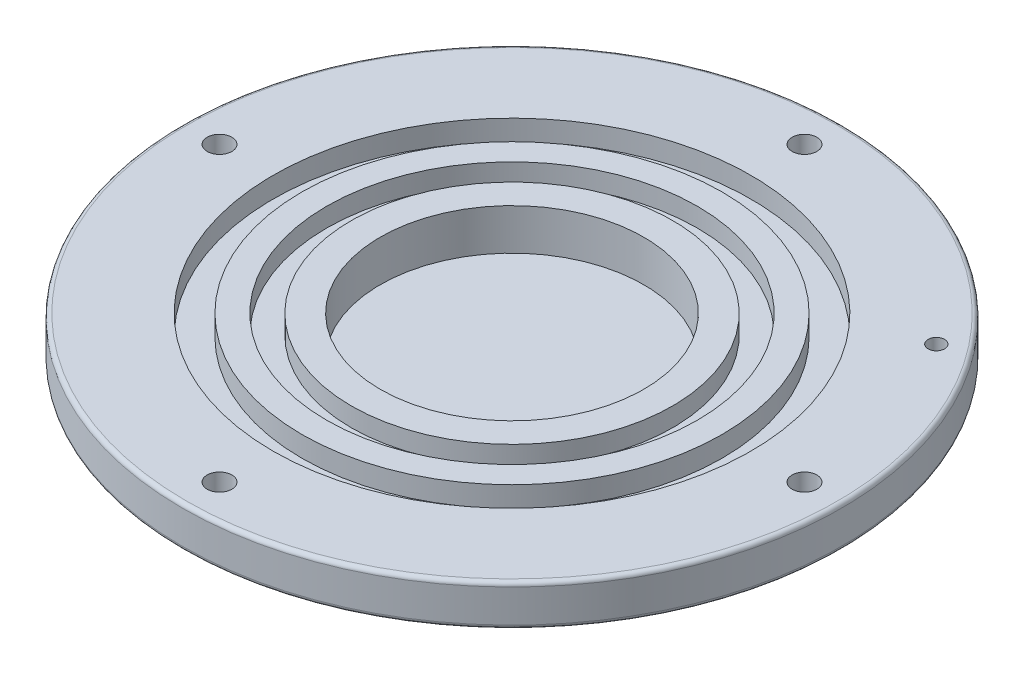
ISO-10303-21;
HEADER;
FILE_DESCRIPTION(('STEP AP214'),'2;1');
FILE_NAME('part.step','',(''),(''),'','','');
FILE_SCHEMA(('AUTOMOTIVE_DESIGN { 1 0 10303 214 1 1 1 1 }'));
ENDSEC;
DATA;
#1=APPLICATION_CONTEXT('core data for automotive mechanical design processes');
#2=APPLICATION_PROTOCOL_DEFINITION('international standard','automotive_design',2000,#1);
#3=PRODUCT_CONTEXT('',#1,'mechanical');
#4=PRODUCT('Part','Part','',(#3));
#5=PRODUCT_RELATED_PRODUCT_CATEGORY('part','',(#4));
#6=PRODUCT_DEFINITION_FORMATION('','',#4);
#7=PRODUCT_DEFINITION_CONTEXT('part definition',#1,'design');
#8=PRODUCT_DEFINITION('design','',#6,#7);
#9=PRODUCT_DEFINITION_SHAPE('','',#8);
#10=(LENGTH_UNIT() NAMED_UNIT(*) SI_UNIT(.MILLI.,.METRE.));
#11=(NAMED_UNIT(*) PLANE_ANGLE_UNIT() SI_UNIT($,.RADIAN.));
#12=(NAMED_UNIT(*) SI_UNIT($,.STERADIAN.) SOLID_ANGLE_UNIT());
#13=UNCERTAINTY_MEASURE_WITH_UNIT(LENGTH_MEASURE(1.E-05),#10,'distance_accuracy_value','');
#14=(GEOMETRIC_REPRESENTATION_CONTEXT(3) GLOBAL_UNCERTAINTY_ASSIGNED_CONTEXT((#13)) GLOBAL_UNIT_ASSIGNED_CONTEXT((#10,
#11,#12)) REPRESENTATION_CONTEXT('',''));
#15=CARTESIAN_POINT('',(0.,0.,0.));
#16=DIRECTION('',(0.,0.,1.));
#17=DIRECTION('',(1.,0.,0.));
#18=AXIS2_PLACEMENT_3D('',#15,#16,#17);
#19=CARTESIAN_POINT('',(0.,-5.,0.));
#20=DIRECTION('',(0.,1.,0.));
#21=DIRECTION('',(0.,0.,1.));
#22=AXIS2_PLACEMENT_3D('',#19,#20,#21);
#23=CYLINDRICAL_SURFACE('',#22,40.);
#24=CARTESIAN_POINT('',(0.,-0.5,0.));
#25=DIRECTION('',(0.,1.,0.));
#26=DIRECTION('',(0.,0.,1.));
#27=AXIS2_PLACEMENT_3D('',#24,#25,#26);
#28=CIRCLE('',#27,40.);
#29=CARTESIAN_POINT('',(0.,-0.5,40.));
#30=VERTEX_POINT('',#29);
#31=EDGE_CURVE('E53',#30,#30,#28,.F.);
#32=ORIENTED_EDGE('',*,*,#31,.T.);
#33=EDGE_LOOP('',(#32));
#34=FACE_BOUND('',#33,.T.);
#35=CARTESIAN_POINT('',(0.,-4.5,0.));
#36=DIRECTION('',(0.,1.,0.));
#37=DIRECTION('',(0.,0.,1.));
#38=AXIS2_PLACEMENT_3D('',#35,#36,#37);
#39=CIRCLE('',#38,40.);
#40=CARTESIAN_POINT('',(0.,-4.5,40.));
#41=VERTEX_POINT('',#40);
#42=EDGE_CURVE('E65',#41,#41,#39,.T.);
#43=ORIENTED_EDGE('',*,*,#42,.T.);
#44=EDGE_LOOP('',(#43));
#45=FACE_BOUND('',#44,.T.);
#46=ADVANCED_FACE('F42',(#34,#45),#23,.T.);
#47=CARTESIAN_POINT('',(0.,-5.,0.));
#48=DIRECTION('',(0.,1.,0.));
#49=DIRECTION('',(0.,0.,1.));
#50=AXIS2_PLACEMENT_3D('',#47,#48,#49);
#51=PLANE('',#50);
#52=CARTESIAN_POINT('',(0.,-5.,0.));
#53=DIRECTION('',(0.,1.,0.));
#54=DIRECTION('',(0.,0.,1.));
#55=AXIS2_PLACEMENT_3D('',#52,#53,#54);
#56=CIRCLE('',#55,39.5);
#57=CARTESIAN_POINT('',(0.,-5.,39.5));
#58=VERTEX_POINT('',#57);
#59=EDGE_CURVE('E62',#58,#58,#56,.F.);
#60=ORIENTED_EDGE('',*,*,#59,.T.);
#61=EDGE_LOOP('',(#60));
#62=FACE_BOUND('',#61,.T.);
#63=CARTESIAN_POINT('',(29.,-5.,-22.5));
#64=DIRECTION('',(0.,1.,0.));
#65=DIRECTION('',(0.,0.,1.));
#66=AXIS2_PLACEMENT_3D('',#63,#64,#65);
#67=CIRCLE('',#66,1.);
#68=CARTESIAN_POINT('',(29.,-5.,-21.5));
#69=VERTEX_POINT('',#68);
#70=EDGE_CURVE('E117',#69,#69,#67,.T.);
#71=ORIENTED_EDGE('',*,*,#70,.T.);
#72=EDGE_LOOP('',(#71));
#73=FACE_BOUND('',#72,.T.);
#74=CARTESIAN_POINT('',(0.,-5.,0.));
#75=DIRECTION('',(0.,1.,0.));
#76=DIRECTION('',(0.,0.,1.));
#77=AXIS2_PLACEMENT_3D('',#74,#75,#76);
#78=CIRCLE('',#77,22.5);
#79=CARTESIAN_POINT('',(0.,-5.,22.5));
#80=VERTEX_POINT('',#79);
#81=EDGE_CURVE('E79',#80,#80,#78,.T.);
#82=ORIENTED_EDGE('',*,*,#81,.T.);
#83=EDGE_LOOP('',(#82));
#84=FACE_BOUND('',#83,.T.);
#85=CARTESIAN_POINT('',(3.71842762586794E-13,-5.,-35.5));
#86=DIRECTION('',(0.,1.,0.));
#87=DIRECTION('',(0.,0.,1.));
#88=AXIS2_PLACEMENT_3D('',#85,#86,#87);
#89=CIRCLE('',#88,1.50000000000001);
#90=CARTESIAN_POINT('',(3.71842762586794E-13,-5.,-34.));
#91=VERTEX_POINT('',#90);
#92=EDGE_CURVE('E88',#91,#91,#89,.T.);
#93=ORIENTED_EDGE('',*,*,#92,.T.);
#94=EDGE_LOOP('',(#93));
#95=FACE_BOUND('',#94,.T.);
#96=CARTESIAN_POINT('',(-1.23947587528931E-13,-5.,35.5));
#97=DIRECTION('',(0.,1.,0.));
#98=DIRECTION('',(0.,0.,1.));
#99=AXIS2_PLACEMENT_3D('',#96,#97,#98);
#100=CIRCLE('',#99,1.5);
#101=CARTESIAN_POINT('',(-1.23947587528931E-13,-5.,37.));
#102=VERTEX_POINT('',#101);
#103=EDGE_CURVE('E82',#102,#102,#100,.T.);
#104=ORIENTED_EDGE('',*,*,#103,.T.);
#105=EDGE_LOOP('',(#104));
#106=FACE_BOUND('',#105,.T.);
#107=CARTESIAN_POINT('',(-35.5,-5.,-2.47895175057862E-13));
#108=DIRECTION('',(0.,1.,0.));
#109=DIRECTION('',(0.,0.,1.));
#110=AXIS2_PLACEMENT_3D('',#107,#108,#109);
#111=CIRCLE('',#110,1.5);
#112=CARTESIAN_POINT('',(-35.5,-5.,1.49999999999975));
#113=VERTEX_POINT('',#112);
#114=EDGE_CURVE('E75',#113,#113,#111,.T.);
#115=ORIENTED_EDGE('',*,*,#114,.T.);
#116=EDGE_LOOP('',(#115));
#117=FACE_BOUND('',#116,.T.);
#118=CARTESIAN_POINT('',(35.5,-5.,0.));
#119=DIRECTION('',(0.,1.,0.));
#120=DIRECTION('',(0.,0.,1.));
#121=AXIS2_PLACEMENT_3D('',#118,#119,#120);
#122=CIRCLE('',#121,1.5);
#123=CARTESIAN_POINT('',(35.5,-5.,1.5));
#124=VERTEX_POINT('',#123);
#125=EDGE_CURVE('E68',#124,#124,#122,.T.);
#126=ORIENTED_EDGE('',*,*,#125,.T.);
#127=EDGE_LOOP('',(#126));
#128=FACE_BOUND('',#127,.T.);
#129=ADVANCED_FACE('F163',(#62,#73,#84,#95,#106,#117,#128),#51,.F.);
#130=CARTESIAN_POINT('',(0.,0.,0.));
#131=DIRECTION('',(0.,1.,0.));
#132=DIRECTION('',(0.,0.,1.));
#133=AXIS2_PLACEMENT_3D('',#130,#131,#132);
#134=PLANE('',#133);
#135=CARTESIAN_POINT('',(0.,0.,0.));
#136=DIRECTION('',(0.,1.,0.));
#137=DIRECTION('',(0.,0.,1.));
#138=AXIS2_PLACEMENT_3D('',#135,#136,#137);
#139=CIRCLE('',#138,39.5);
#140=CARTESIAN_POINT('',(0.,0.,39.5));
#141=VERTEX_POINT('',#140);
#142=EDGE_CURVE('E57',#141,#141,#139,.T.);
#143=ORIENTED_EDGE('',*,*,#142,.T.);
#144=EDGE_LOOP('',(#143));
#145=FACE_BOUND('',#144,.T.);
#146=CARTESIAN_POINT('',(29.,0.,-22.5));
#147=DIRECTION('',(0.,1.,0.));
#148=DIRECTION('',(0.,0.,1.));
#149=AXIS2_PLACEMENT_3D('',#146,#147,#148);
#150=CIRCLE('',#149,1.);
#151=CARTESIAN_POINT('',(29.,0.,-21.5));
#152=VERTEX_POINT('',#151);
#153=EDGE_CURVE('E122',#152,#152,#150,.T.);
#154=ORIENTED_EDGE('',*,*,#153,.F.);
#155=EDGE_LOOP('',(#154));
#156=FACE_BOUND('',#155,.T.);
#157=CARTESIAN_POINT('',(0.,0.,0.));
#158=DIRECTION('',(0.,1.,0.));
#159=DIRECTION('',(0.,0.,1.));
#160=AXIS2_PLACEMENT_3D('',#157,#158,#159);
#161=CIRCLE('',#160,29.);
#162=CARTESIAN_POINT('',(0.,0.,29.));
#163=VERTEX_POINT('',#162);
#164=EDGE_CURVE('E108',#163,#163,#161,.T.);
#165=ORIENTED_EDGE('',*,*,#164,.F.);
#166=EDGE_LOOP('',(#165));
#167=FACE_BOUND('',#166,.T.);
#168=CARTESIAN_POINT('',(3.71842762586794E-13,0.,-35.5));
#169=DIRECTION('',(0.,1.,0.));
#170=DIRECTION('',(0.,0.,1.));
#171=AXIS2_PLACEMENT_3D('',#168,#169,#170);
#172=CIRCLE('',#171,1.50000000000001);
#173=CARTESIAN_POINT('',(3.71842762586794E-13,0.,-34.));
#174=VERTEX_POINT('',#173);
#175=EDGE_CURVE('E72',#174,#174,#172,.T.);
#176=ORIENTED_EDGE('',*,*,#175,.F.);
#177=EDGE_LOOP('',(#176));
#178=FACE_BOUND('',#177,.T.);
#179=CARTESIAN_POINT('',(-1.23947587528931E-13,0.,35.5));
#180=DIRECTION('',(0.,1.,0.));
#181=DIRECTION('',(0.,0.,1.));
#182=AXIS2_PLACEMENT_3D('',#179,#180,#181);
#183=CIRCLE('',#182,1.5);
#184=CARTESIAN_POINT('',(-1.23947587528931E-13,0.,37.));
#185=VERTEX_POINT('',#184);
#186=EDGE_CURVE('E85',#185,#185,#183,.T.);
#187=ORIENTED_EDGE('',*,*,#186,.F.);
#188=EDGE_LOOP('',(#187));
#189=FACE_BOUND('',#188,.T.);
#190=CARTESIAN_POINT('',(-35.5,0.,-2.47895175057862E-13));
#191=DIRECTION('',(0.,1.,0.));
#192=DIRECTION('',(0.,0.,1.));
#193=AXIS2_PLACEMENT_3D('',#190,#191,#192);
#194=CIRCLE('',#193,1.5);
#195=CARTESIAN_POINT('',(-35.5,0.,1.49999999999975));
#196=VERTEX_POINT('',#195);
#197=EDGE_CURVE('E78',#196,#196,#194,.T.);
#198=ORIENTED_EDGE('',*,*,#197,.F.);
#199=EDGE_LOOP('',(#198));
#200=FACE_BOUND('',#199,.T.);
#201=CARTESIAN_POINT('',(35.5,0.,0.));
#202=DIRECTION('',(0.,1.,0.));
#203=DIRECTION('',(0.,0.,1.));
#204=AXIS2_PLACEMENT_3D('',#201,#202,#203);
#205=CIRCLE('',#204,1.5);
#206=CARTESIAN_POINT('',(35.5,0.,1.5));
#207=VERTEX_POINT('',#206);
#208=EDGE_CURVE('E69',#207,#207,#205,.T.);
#209=ORIENTED_EDGE('',*,*,#208,.F.);
#210=EDGE_LOOP('',(#209));
#211=FACE_BOUND('',#210,.T.);
#212=ADVANCED_FACE('F147',(#145,#156,#167,#178,#189,#200,#211),#134,.T.);
#213=CARTESIAN_POINT('',(35.5,-5.,0.));
#214=DIRECTION('',(0.,1.,0.));
#215=DIRECTION('',(0.,0.,1.));
#216=AXIS2_PLACEMENT_3D('',#213,#214,#215);
#217=CYLINDRICAL_SURFACE('',#216,1.5);
#218=ORIENTED_EDGE('',*,*,#125,.F.);
#219=EDGE_LOOP('',(#218));
#220=FACE_BOUND('',#219,.T.);
#221=ORIENTED_EDGE('',*,*,#208,.T.);
#222=EDGE_LOOP('',(#221));
#223=FACE_BOUND('',#222,.T.);
#224=ADVANCED_FACE('F189',(#220,#223),#217,.F.);
#225=CARTESIAN_POINT('',(-35.5,-5.,-2.47895175057862E-13));
#226=DIRECTION('',(0.,1.,0.));
#227=DIRECTION('',(0.,0.,1.));
#228=AXIS2_PLACEMENT_3D('',#225,#226,#227);
#229=CYLINDRICAL_SURFACE('',#228,1.5);
#230=ORIENTED_EDGE('',*,*,#114,.F.);
#231=EDGE_LOOP('',(#230));
#232=FACE_BOUND('',#231,.T.);
#233=ORIENTED_EDGE('',*,*,#197,.T.);
#234=EDGE_LOOP('',(#233));
#235=FACE_BOUND('',#234,.T.);
#236=ADVANCED_FACE('F203',(#232,#235),#229,.F.);
#237=CARTESIAN_POINT('',(-1.23947587528931E-13,-5.,35.5));
#238=DIRECTION('',(0.,1.,0.));
#239=DIRECTION('',(0.,0.,1.));
#240=AXIS2_PLACEMENT_3D('',#237,#238,#239);
#241=CYLINDRICAL_SURFACE('',#240,1.5);
#242=ORIENTED_EDGE('',*,*,#103,.F.);
#243=EDGE_LOOP('',(#242));
#244=FACE_BOUND('',#243,.T.);
#245=ORIENTED_EDGE('',*,*,#186,.T.);
#246=EDGE_LOOP('',(#245));
#247=FACE_BOUND('',#246,.T.);
#248=ADVANCED_FACE('F209',(#244,#247),#241,.F.);
#249=CARTESIAN_POINT('',(3.71842762586794E-13,-5.,-35.5));
#250=DIRECTION('',(0.,1.,0.));
#251=DIRECTION('',(0.,0.,1.));
#252=AXIS2_PLACEMENT_3D('',#249,#250,#251);
#253=CYLINDRICAL_SURFACE('',#252,1.50000000000001);
#254=ORIENTED_EDGE('',*,*,#92,.F.);
#255=EDGE_LOOP('',(#254));
#256=FACE_BOUND('',#255,.T.);
#257=ORIENTED_EDGE('',*,*,#175,.T.);
#258=EDGE_LOOP('',(#257));
#259=FACE_BOUND('',#258,.T.);
#260=ADVANCED_FACE('F216',(#256,#259),#253,.F.);
#261=CARTESIAN_POINT('',(0.,-10.,0.));
#262=DIRECTION('',(0.,1.,0.));
#263=DIRECTION('',(0.,0.,1.));
#264=AXIS2_PLACEMENT_3D('',#261,#262,#263);
#265=CYLINDRICAL_SURFACE('',#264,22.5);
#266=CARTESIAN_POINT('',(0.,-9.5,0.));
#267=DIRECTION('',(0.,1.,0.));
#268=DIRECTION('',(0.,0.,1.));
#269=AXIS2_PLACEMENT_3D('',#266,#267,#268);
#270=CIRCLE('',#269,22.5);
#271=CARTESIAN_POINT('',(0.,-9.5,22.5));
#272=VERTEX_POINT('',#271);
#273=EDGE_CURVE('E49',#272,#272,#270,.T.);
#274=ORIENTED_EDGE('',*,*,#273,.T.);
#275=EDGE_LOOP('',(#274));
#276=FACE_BOUND('',#275,.T.);
#277=ORIENTED_EDGE('',*,*,#81,.F.);
#278=EDGE_LOOP('',(#277));
#279=FACE_BOUND('',#278,.T.);
#280=ADVANCED_FACE('F220',(#276,#279),#265,.T.);
#281=CARTESIAN_POINT('',(0.,-10.,0.));
#282=DIRECTION('',(0.,1.,0.));
#283=DIRECTION('',(0.,0.,1.));
#284=AXIS2_PLACEMENT_3D('',#281,#282,#283);
#285=PLANE('',#284);
#286=CARTESIAN_POINT('',(0.,-10.,0.));
#287=DIRECTION('',(0.,1.,0.));
#288=DIRECTION('',(0.,0.,1.));
#289=AXIS2_PLACEMENT_3D('',#286,#287,#288);
#290=CIRCLE('',#289,22.);
#291=CARTESIAN_POINT('',(0.,-10.,22.));
#292=VERTEX_POINT('',#291);
#293=EDGE_CURVE('E11',#292,#292,#290,.F.);
#294=ORIENTED_EDGE('',*,*,#293,.T.);
#295=EDGE_LOOP('',(#294));
#296=FACE_BOUND('',#295,.T.);
#297=ADVANCED_FACE('F224',(#296),#285,.F.);
#298=CARTESIAN_POINT('',(0.,-2.5,0.));
#299=DIRECTION('',(0.,1.,0.));
#300=DIRECTION('',(0.,0.,1.));
#301=AXIS2_PLACEMENT_3D('',#298,#299,#300);
#302=CYLINDRICAL_SURFACE('',#301,29.);
#303=CARTESIAN_POINT('',(0.,-2.5,0.));
#304=DIRECTION('',(0.,1.,0.));
#305=DIRECTION('',(0.,0.,1.));
#306=AXIS2_PLACEMENT_3D('',#303,#304,#305);
#307=CIRCLE('',#306,29.);
#308=CARTESIAN_POINT('',(0.,-2.5,29.));
#309=VERTEX_POINT('',#308);
#310=EDGE_CURVE('E105',#309,#309,#307,.T.);
#311=ORIENTED_EDGE('',*,*,#310,.F.);
#312=EDGE_LOOP('',(#311));
#313=FACE_BOUND('',#312,.T.);
#314=ORIENTED_EDGE('',*,*,#164,.T.);
#315=EDGE_LOOP('',(#314));
#316=FACE_BOUND('',#315,.T.);
#317=ADVANCED_FACE('F227',(#313,#316),#302,.F.);
#318=CARTESIAN_POINT('',(0.,-2.5,0.));
#319=DIRECTION('',(0.,1.,0.));
#320=DIRECTION('',(0.,0.,1.));
#321=AXIS2_PLACEMENT_3D('',#318,#319,#320);
#322=PLANE('',#321);
#323=CARTESIAN_POINT('',(0.,-2.5,0.));
#324=DIRECTION('',(0.,1.,0.));
#325=DIRECTION('',(0.,0.,1.));
#326=AXIS2_PLACEMENT_3D('',#323,#324,#325);
#327=CIRCLE('',#326,25.5);
#328=CARTESIAN_POINT('',(0.,-2.5,25.5));
#329=VERTEX_POINT('',#328);
#330=EDGE_CURVE('E111',#329,#329,#327,.T.);
#331=ORIENTED_EDGE('',*,*,#330,.F.);
#332=EDGE_LOOP('',(#331));
#333=FACE_BOUND('',#332,.T.);
#334=ORIENTED_EDGE('',*,*,#310,.T.);
#335=EDGE_LOOP('',(#334));
#336=FACE_BOUND('',#335,.T.);
#337=ADVANCED_FACE('F241',(#333,#336),#322,.T.);
#338=CARTESIAN_POINT('',(0.,-2.5,0.));
#339=DIRECTION('',(0.,1.,0.));
#340=DIRECTION('',(0.,0.,1.));
#341=AXIS2_PLACEMENT_3D('',#338,#339,#340);
#342=CYLINDRICAL_SURFACE('',#341,25.5);
#343=ORIENTED_EDGE('',*,*,#330,.T.);
#344=EDGE_LOOP('',(#343));
#345=FACE_BOUND('',#344,.T.);
#346=CARTESIAN_POINT('',(0.,0.,0.));
#347=DIRECTION('',(0.,1.,0.));
#348=DIRECTION('',(0.,0.,1.));
#349=AXIS2_PLACEMENT_3D('',#346,#347,#348);
#350=CIRCLE('',#349,25.5);
#351=CARTESIAN_POINT('',(0.,0.,25.5));
#352=VERTEX_POINT('',#351);
#353=EDGE_CURVE('E114',#352,#352,#350,.T.);
#354=ORIENTED_EDGE('',*,*,#353,.F.);
#355=EDGE_LOOP('',(#354));
#356=FACE_BOUND('',#355,.T.);
#357=ADVANCED_FACE('F145',(#345,#356),#342,.T.);
#358=CARTESIAN_POINT('',(0.,0.,0.));
#359=DIRECTION('',(0.,1.,0.));
#360=DIRECTION('',(0.,0.,1.));
#361=AXIS2_PLACEMENT_3D('',#358,#359,#360);
#362=CIRCLE('',#361,16.);
#363=CARTESIAN_POINT('',(0.,0.,16.));
#364=VERTEX_POINT('',#363);
#365=EDGE_CURVE('E126',#364,#364,#362,.T.);
#366=ORIENTED_EDGE('',*,*,#365,.F.);
#367=EDGE_LOOP('',(#366));
#368=FACE_BOUND('',#367,.T.);
#369=CARTESIAN_POINT('',(0.,0.,0.));
#370=DIRECTION('',(0.,1.,0.));
#371=DIRECTION('',(0.,0.,1.));
#372=AXIS2_PLACEMENT_3D('',#369,#370,#371);
#373=CIRCLE('',#372,19.5);
#374=CARTESIAN_POINT('',(0.,0.,19.5));
#375=VERTEX_POINT('',#374);
#376=EDGE_CURVE('E102',#375,#375,#373,.T.);
#377=ORIENTED_EDGE('',*,*,#376,.T.);
#378=EDGE_LOOP('',(#377));
#379=FACE_BOUND('',#378,.T.);
#380=ADVANCED_FACE('F141',(#368,#379),#134,.T.);
#381=CARTESIAN_POINT('',(0.,-2.3,0.));
#382=DIRECTION('',(0.,1.,0.));
#383=DIRECTION('',(0.,0.,1.));
#384=AXIS2_PLACEMENT_3D('',#381,#382,#383);
#385=CYLINDRICAL_SURFACE('',#384,19.5);
#386=CARTESIAN_POINT('',(0.,-2.3,0.));
#387=DIRECTION('',(0.,1.,0.));
#388=DIRECTION('',(0.,0.,1.));
#389=AXIS2_PLACEMENT_3D('',#386,#387,#388);
#390=CIRCLE('',#389,19.5);
#391=CARTESIAN_POINT('',(0.,-2.3,19.5));
#392=VERTEX_POINT('',#391);
#393=EDGE_CURVE('E99',#392,#392,#390,.T.);
#394=ORIENTED_EDGE('',*,*,#393,.T.);
#395=EDGE_LOOP('',(#394));
#396=FACE_BOUND('',#395,.T.);
#397=ORIENTED_EDGE('',*,*,#376,.F.);
#398=EDGE_LOOP('',(#397));
#399=FACE_BOUND('',#398,.T.);
#400=ADVANCED_FACE('F144',(#396,#399),#385,.T.);
#401=CARTESIAN_POINT('',(0.,-2.3,0.));
#402=DIRECTION('',(0.,1.,0.));
#403=DIRECTION('',(0.,0.,1.));
#404=AXIS2_PLACEMENT_3D('',#401,#402,#403);
#405=PLANE('',#404);
#406=ORIENTED_EDGE('',*,*,#393,.F.);
#407=EDGE_LOOP('',(#406));
#408=FACE_BOUND('',#407,.T.);
#409=CARTESIAN_POINT('',(0.,-2.3,0.));
#410=DIRECTION('',(0.,1.,0.));
#411=DIRECTION('',(0.,0.,1.));
#412=AXIS2_PLACEMENT_3D('',#409,#410,#411);
#413=CIRCLE('',#412,22.5);
#414=CARTESIAN_POINT('',(0.,-2.3,22.5));
#415=VERTEX_POINT('',#414);
#416=EDGE_CURVE('E95',#415,#415,#413,.T.);
#417=ORIENTED_EDGE('',*,*,#416,.T.);
#418=EDGE_LOOP('',(#417));
#419=FACE_BOUND('',#418,.T.);
#420=ADVANCED_FACE('F152',(#408,#419),#405,.T.);
#421=CARTESIAN_POINT('',(0.,-2.3,0.));
#422=DIRECTION('',(0.,1.,0.));
#423=DIRECTION('',(0.,0.,1.));
#424=AXIS2_PLACEMENT_3D('',#421,#422,#423);
#425=CYLINDRICAL_SURFACE('',#424,22.5);
#426=ORIENTED_EDGE('',*,*,#416,.F.);
#427=EDGE_LOOP('',(#426));
#428=FACE_BOUND('',#427,.T.);
#429=CARTESIAN_POINT('',(0.,0.,0.));
#430=DIRECTION('',(0.,1.,0.));
#431=DIRECTION('',(0.,0.,1.));
#432=AXIS2_PLACEMENT_3D('',#429,#430,#431);
#433=CIRCLE('',#432,22.5);
#434=CARTESIAN_POINT('',(0.,0.,22.5));
#435=VERTEX_POINT('',#434);
#436=EDGE_CURVE('E96',#435,#435,#433,.T.);
#437=ORIENTED_EDGE('',*,*,#436,.T.);
#438=EDGE_LOOP('',(#437));
#439=FACE_BOUND('',#438,.T.);
#440=ADVANCED_FACE('F158',(#428,#439),#425,.F.);
#441=ORIENTED_EDGE('',*,*,#436,.F.);
#442=EDGE_LOOP('',(#441));
#443=FACE_BOUND('',#442,.T.);
#444=ORIENTED_EDGE('',*,*,#353,.T.);
#445=EDGE_LOOP('',(#444));
#446=FACE_BOUND('',#445,.T.);
#447=ADVANCED_FACE('F148',(#443,#446),#134,.T.);
#448=CARTESIAN_POINT('',(29.,-10.,-22.5));
#449=DIRECTION('',(0.,1.,0.));
#450=DIRECTION('',(0.,0.,1.));
#451=AXIS2_PLACEMENT_3D('',#448,#449,#450);
#452=CYLINDRICAL_SURFACE('',#451,1.);
#453=ORIENTED_EDGE('',*,*,#153,.T.);
#454=EDGE_LOOP('',(#453));
#455=FACE_BOUND('',#454,.T.);
#456=ORIENTED_EDGE('',*,*,#70,.F.);
#457=EDGE_LOOP('',(#456));
#458=FACE_BOUND('',#457,.T.);
#459=ADVANCED_FACE('F137',(#455,#458),#452,.F.);
#460=CARTESIAN_POINT('',(0.,-5.,0.));
#461=DIRECTION('',(0.,1.,0.));
#462=DIRECTION('',(0.,0.,1.));
#463=AXIS2_PLACEMENT_3D('',#460,#461,#462);
#464=CYLINDRICAL_SURFACE('',#463,16.);
#465=CARTESIAN_POINT('',(0.,-5.,0.));
#466=DIRECTION('',(0.,1.,0.));
#467=DIRECTION('',(0.,0.,1.));
#468=AXIS2_PLACEMENT_3D('',#465,#466,#467);
#469=CIRCLE('',#468,16.);
#470=CARTESIAN_POINT('',(0.,-5.,16.));
#471=VERTEX_POINT('',#470);
#472=EDGE_CURVE('E125',#471,#471,#469,.T.);
#473=ORIENTED_EDGE('',*,*,#472,.F.);
#474=EDGE_LOOP('',(#473));
#475=FACE_BOUND('',#474,.T.);
#476=ORIENTED_EDGE('',*,*,#365,.T.);
#477=EDGE_LOOP('',(#476));
#478=FACE_BOUND('',#477,.T.);
#479=ADVANCED_FACE('F134',(#475,#478),#464,.F.);
#480=CARTESIAN_POINT('',(0.,-5.,0.));
#481=DIRECTION('',(0.,1.,0.));
#482=DIRECTION('',(0.,0.,1.));
#483=AXIS2_PLACEMENT_3D('',#480,#481,#482);
#484=PLANE('',#483);
#485=ORIENTED_EDGE('',*,*,#472,.T.);
#486=EDGE_LOOP('',(#485));
#487=FACE_BOUND('',#486,.T.);
#488=ADVANCED_FACE('F132',(#487),#484,.T.);
#489=CARTESIAN_POINT('',(0.,-4.5,0.));
#490=DIRECTION('',(0.,1.,0.));
#491=DIRECTION('',(0.,0.,1.));
#492=AXIS2_PLACEMENT_3D('',#489,#490,#491);
#493=TOROIDAL_SURFACE('',#492,39.5,0.5);
#494=ORIENTED_EDGE('',*,*,#59,.F.);
#495=EDGE_LOOP('',(#494));
#496=FACE_BOUND('',#495,.T.);
#497=ORIENTED_EDGE('',*,*,#42,.F.);
#498=EDGE_LOOP('',(#497));
#499=FACE_BOUND('',#498,.T.);
#500=ADVANCED_FACE('F173',(#496,#499),#493,.T.);
#501=CARTESIAN_POINT('',(0.,-0.5,0.));
#502=DIRECTION('',(0.,1.,0.));
#503=DIRECTION('',(0.,0.,1.));
#504=AXIS2_PLACEMENT_3D('',#501,#502,#503);
#505=TOROIDAL_SURFACE('',#504,39.5,0.5);
#506=ORIENTED_EDGE('',*,*,#31,.F.);
#507=EDGE_LOOP('',(#506));
#508=FACE_BOUND('',#507,.T.);
#509=ORIENTED_EDGE('',*,*,#142,.F.);
#510=EDGE_LOOP('',(#509));
#511=FACE_BOUND('',#510,.T.);
#512=ADVANCED_FACE('F175',(#508,#511),#505,.T.);
#513=CARTESIAN_POINT('',(0.,-9.5,0.));
#514=DIRECTION('',(0.,1.,0.));
#515=DIRECTION('',(0.,0.,1.));
#516=AXIS2_PLACEMENT_3D('',#513,#514,#515);
#517=TOROIDAL_SURFACE('',#516,22.,0.5);
#518=ORIENTED_EDGE('',*,*,#293,.F.);
#519=EDGE_LOOP('',(#518));
#520=FACE_BOUND('',#519,.T.);
#521=ORIENTED_EDGE('',*,*,#273,.F.);
#522=EDGE_LOOP('',(#521));
#523=FACE_BOUND('',#522,.T.);
#524=ADVANCED_FACE('F44',(#520,#523),#517,.T.);
#525=CLOSED_SHELL('',(#46,#129,#212,#224,#236,#248,#260,#280,#297,#317,#337,#357,#380,#400,#420,
#440,#447,#459,#479,#488,#500,#512,#524));
#526=MANIFOLD_SOLID_BREP('B2',#525);
#527=ADVANCED_BREP_SHAPE_REPRESENTATION('',(#18,#526),#14);
#528=SHAPE_DEFINITION_REPRESENTATION(#9,#527);
ENDSEC;
END-ISO-10303-21;
